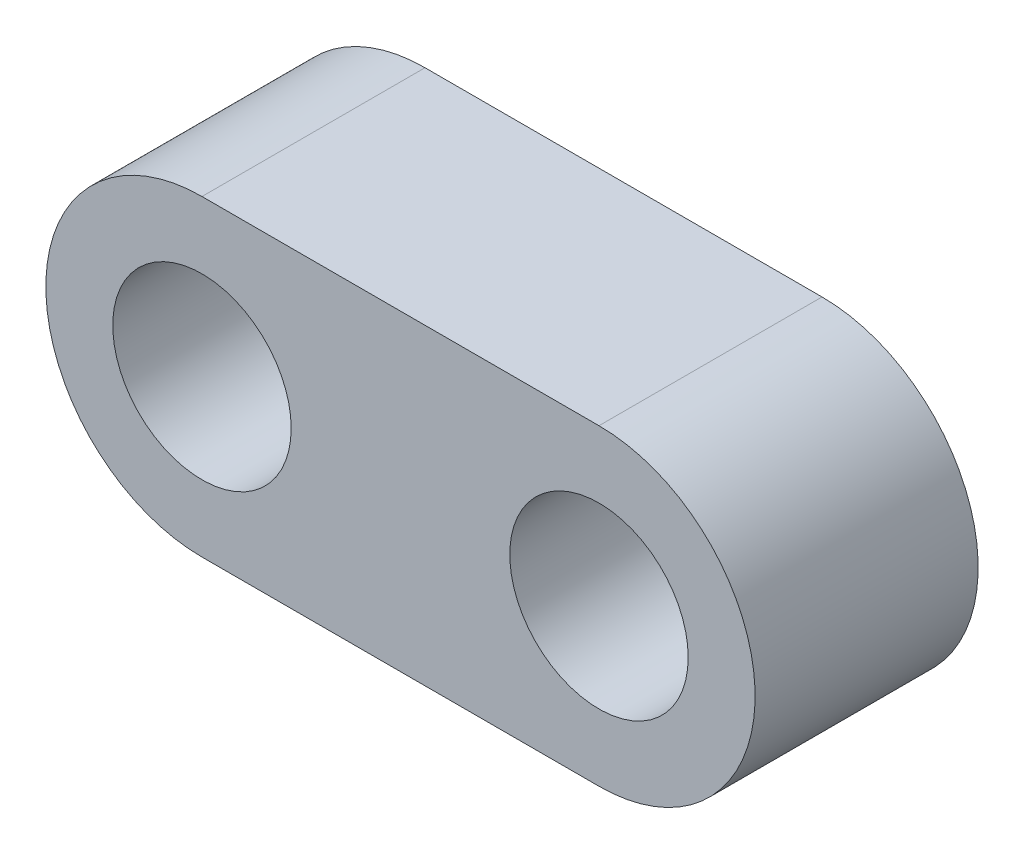
ISO-10303-21;
HEADER;
FILE_DESCRIPTION(('STEP AP214'),'2;1');
FILE_NAME('part.step','',(''),(''),'','','');
FILE_SCHEMA(('AUTOMOTIVE_DESIGN { 1 0 10303 214 1 1 1 1 }'));
ENDSEC;
DATA;
#1=APPLICATION_CONTEXT('core data for automotive mechanical design processes');
#2=APPLICATION_PROTOCOL_DEFINITION('international standard','automotive_design',2000,#1);
#3=PRODUCT_CONTEXT('',#1,'mechanical');
#4=PRODUCT('Part','Part','',(#3));
#5=PRODUCT_RELATED_PRODUCT_CATEGORY('part','',(#4));
#6=PRODUCT_DEFINITION_FORMATION('','',#4);
#7=PRODUCT_DEFINITION_CONTEXT('part definition',#1,'design');
#8=PRODUCT_DEFINITION('design','',#6,#7);
#9=PRODUCT_DEFINITION_SHAPE('','',#8);
#10=(LENGTH_UNIT() NAMED_UNIT(*) SI_UNIT(.MILLI.,.METRE.));
#11=(NAMED_UNIT(*) PLANE_ANGLE_UNIT() SI_UNIT($,.RADIAN.));
#12=(NAMED_UNIT(*) SI_UNIT($,.STERADIAN.) SOLID_ANGLE_UNIT());
#13=UNCERTAINTY_MEASURE_WITH_UNIT(LENGTH_MEASURE(1.E-05),#10,'distance_accuracy_value','');
#14=(GEOMETRIC_REPRESENTATION_CONTEXT(3) GLOBAL_UNCERTAINTY_ASSIGNED_CONTEXT((#13)) GLOBAL_UNIT_ASSIGNED_CONTEXT((#10,
#11,#12)) REPRESENTATION_CONTEXT('',''));
#15=CARTESIAN_POINT('',(0.,0.,0.));
#16=DIRECTION('',(0.,0.,1.));
#17=DIRECTION('',(1.,0.,0.));
#18=AXIS2_PLACEMENT_3D('',#15,#16,#17);
#19=CARTESIAN_POINT('',(0.,-35.,50.));
#20=DIRECTION('',(0.,-1.,0.));
#21=DIRECTION('',(1.,0.,0.));
#22=AXIS2_PLACEMENT_3D('',#19,#20,#21);
#23=PLANE('',#22);
#24=DIRECTION('',(-1.,0.,0.));
#25=VECTOR('',#24,1.);
#26=CARTESIAN_POINT('',(0.,-35.,0.));
#27=LINE('',#26,#25);
#28=CARTESIAN_POINT('',(89.,-35.,0.));
#29=VERTEX_POINT('',#28);
#30=CARTESIAN_POINT('',(0.,-35.,0.));
#31=VERTEX_POINT('',#30);
#32=EDGE_CURVE('E113',#29,#31,#27,.T.);
#33=ORIENTED_EDGE('',*,*,#32,.F.);
#34=DIRECTION('',(0.,0.,-1.));
#35=VECTOR('',#34,1.);
#36=CARTESIAN_POINT('',(89.,-35.,50.));
#37=LINE('',#36,#35);
#38=CARTESIAN_POINT('',(89.,-35.,50.));
#39=VERTEX_POINT('',#38);
#40=EDGE_CURVE('E11',#39,#29,#37,.T.);
#41=ORIENTED_EDGE('',*,*,#40,.F.);
#42=DIRECTION('',(-1.,0.,0.));
#43=VECTOR('',#42,1.);
#44=CARTESIAN_POINT('',(0.,-35.,50.));
#45=LINE('',#44,#43);
#46=CARTESIAN_POINT('',(0.,-35.,50.));
#47=VERTEX_POINT('',#46);
#48=EDGE_CURVE('E94',#39,#47,#45,.T.);
#49=ORIENTED_EDGE('',*,*,#48,.T.);
#50=DIRECTION('',(0.,0.,-1.));
#51=VECTOR('',#50,1.);
#52=CARTESIAN_POINT('',(0.,-35.,50.));
#53=LINE('',#52,#51);
#54=EDGE_CURVE('E81',#47,#31,#53,.T.);
#55=ORIENTED_EDGE('',*,*,#54,.T.);
#56=EDGE_LOOP('',(#33,#41,#49,#55));
#57=FACE_BOUND('',#56,.T.);
#58=ADVANCED_FACE('F44',(#57),#23,.T.);
#59=CARTESIAN_POINT('',(89.,0.,50.));
#60=DIRECTION('',(0.,0.,-1.));
#61=DIRECTION('',(-1.,0.,0.));
#62=AXIS2_PLACEMENT_3D('',#59,#60,#61);
#63=CYLINDRICAL_SURFACE('',#62,35.);
#64=CARTESIAN_POINT('',(89.,0.,0.));
#65=DIRECTION('',(0.,0.,1.));
#66=DIRECTION('',(1.,0.,0.));
#67=AXIS2_PLACEMENT_3D('',#64,#65,#66);
#68=CIRCLE('',#67,35.);
#69=CARTESIAN_POINT('',(89.,35.,0.));
#70=VERTEX_POINT('',#69);
#71=EDGE_CURVE('E99',#29,#70,#68,.T.);
#72=ORIENTED_EDGE('',*,*,#71,.T.);
#73=DIRECTION('',(0.,0.,-1.));
#74=VECTOR('',#73,1.);
#75=CARTESIAN_POINT('',(89.,35.,50.));
#76=LINE('',#75,#74);
#77=CARTESIAN_POINT('',(89.,35.,50.));
#78=VERTEX_POINT('',#77);
#79=EDGE_CURVE('E53',#78,#70,#76,.T.);
#80=ORIENTED_EDGE('',*,*,#79,.F.);
#81=CARTESIAN_POINT('',(89.,0.,50.));
#82=DIRECTION('',(0.,0.,1.));
#83=DIRECTION('',(1.,0.,0.));
#84=AXIS2_PLACEMENT_3D('',#81,#82,#83);
#85=CIRCLE('',#84,35.);
#86=EDGE_CURVE('E90',#39,#78,#85,.T.);
#87=ORIENTED_EDGE('',*,*,#86,.F.);
#88=ORIENTED_EDGE('',*,*,#40,.T.);
#89=EDGE_LOOP('',(#72,#80,#87,#88));
#90=FACE_BOUND('',#89,.T.);
#91=ADVANCED_FACE('F98',(#90),#63,.T.);
#92=CARTESIAN_POINT('',(0.,35.,50.));
#93=DIRECTION('',(0.,1.,0.));
#94=DIRECTION('',(-1.,0.,0.));
#95=AXIS2_PLACEMENT_3D('',#92,#93,#94);
#96=PLANE('',#95);
#97=DIRECTION('',(1.,0.,0.));
#98=VECTOR('',#97,1.);
#99=CARTESIAN_POINT('',(0.,35.,0.));
#100=LINE('',#99,#98);
#101=CARTESIAN_POINT('',(0.,35.,0.));
#102=VERTEX_POINT('',#101);
#103=EDGE_CURVE('E120',#102,#70,#100,.T.);
#104=ORIENTED_EDGE('',*,*,#103,.F.);
#105=DIRECTION('',(0.,0.,-1.));
#106=VECTOR('',#105,1.);
#107=CARTESIAN_POINT('',(0.,35.,50.));
#108=LINE('',#107,#106);
#109=CARTESIAN_POINT('',(0.,35.,50.));
#110=VERTEX_POINT('',#109);
#111=EDGE_CURVE('E79',#110,#102,#108,.T.);
#112=ORIENTED_EDGE('',*,*,#111,.F.);
#113=DIRECTION('',(1.,0.,0.));
#114=VECTOR('',#113,1.);
#115=CARTESIAN_POINT('',(0.,35.,50.));
#116=LINE('',#115,#114);
#117=EDGE_CURVE('E91',#110,#78,#116,.T.);
#118=ORIENTED_EDGE('',*,*,#117,.T.);
#119=ORIENTED_EDGE('',*,*,#79,.T.);
#120=EDGE_LOOP('',(#104,#112,#118,#119));
#121=FACE_BOUND('',#120,.T.);
#122=ADVANCED_FACE('F102',(#121),#96,.T.);
#123=CARTESIAN_POINT('',(0.,0.,50.));
#124=DIRECTION('',(0.,0.,-1.));
#125=DIRECTION('',(-1.,0.,0.));
#126=AXIS2_PLACEMENT_3D('',#123,#124,#125);
#127=CYLINDRICAL_SURFACE('',#126,20.);
#128=CARTESIAN_POINT('',(0.,0.,50.));
#129=DIRECTION('',(0.,0.,1.));
#130=DIRECTION('',(1.,0.,0.));
#131=AXIS2_PLACEMENT_3D('',#128,#129,#130);
#132=CIRCLE('',#131,20.);
#133=CARTESIAN_POINT('',(20.,0.,50.));
#134=VERTEX_POINT('',#133);
#135=EDGE_CURVE('E127',#134,#134,#132,.T.);
#136=ORIENTED_EDGE('',*,*,#135,.T.);
#137=EDGE_LOOP('',(#136));
#138=FACE_BOUND('',#137,.T.);
#139=CARTESIAN_POINT('',(0.,0.,0.));
#140=DIRECTION('',(0.,0.,1.));
#141=DIRECTION('',(1.,0.,0.));
#142=AXIS2_PLACEMENT_3D('',#139,#140,#141);
#143=CIRCLE('',#142,20.);
#144=CARTESIAN_POINT('',(20.,0.,0.));
#145=VERTEX_POINT('',#144);
#146=EDGE_CURVE('E115',#145,#145,#143,.T.);
#147=ORIENTED_EDGE('',*,*,#146,.F.);
#148=EDGE_LOOP('',(#147));
#149=FACE_BOUND('',#148,.T.);
#150=ADVANCED_FACE('F136',(#138,#149),#127,.F.);
#151=CARTESIAN_POINT('',(89.,0.,50.));
#152=DIRECTION('',(0.,0.,-1.));
#153=DIRECTION('',(-1.,0.,0.));
#154=AXIS2_PLACEMENT_3D('',#151,#152,#153);
#155=CYLINDRICAL_SURFACE('',#154,20.);
#156=CARTESIAN_POINT('',(89.,0.,50.));
#157=DIRECTION('',(0.,0.,1.));
#158=DIRECTION('',(1.,0.,0.));
#159=AXIS2_PLACEMENT_3D('',#156,#157,#158);
#160=CIRCLE('',#159,20.);
#161=CARTESIAN_POINT('',(109.,0.,50.));
#162=VERTEX_POINT('',#161);
#163=EDGE_CURVE('E125',#162,#162,#160,.T.);
#164=ORIENTED_EDGE('',*,*,#163,.T.);
#165=EDGE_LOOP('',(#164));
#166=FACE_BOUND('',#165,.T.);
#167=CARTESIAN_POINT('',(89.,0.,0.));
#168=DIRECTION('',(0.,0.,1.));
#169=DIRECTION('',(1.,0.,0.));
#170=AXIS2_PLACEMENT_3D('',#167,#168,#169);
#171=CIRCLE('',#170,20.);
#172=CARTESIAN_POINT('',(109.,0.,0.));
#173=VERTEX_POINT('',#172);
#174=EDGE_CURVE('E108',#173,#173,#171,.T.);
#175=ORIENTED_EDGE('',*,*,#174,.F.);
#176=EDGE_LOOP('',(#175));
#177=FACE_BOUND('',#176,.T.);
#178=ADVANCED_FACE('F50',(#166,#177),#155,.F.);
#179=CARTESIAN_POINT('',(0.,0.,50.));
#180=DIRECTION('',(0.,0.,-1.));
#181=DIRECTION('',(-1.,0.,0.));
#182=AXIS2_PLACEMENT_3D('',#179,#180,#181);
#183=CYLINDRICAL_SURFACE('',#182,35.);
#184=CARTESIAN_POINT('',(0.,0.,0.));
#185=DIRECTION('',(0.,0.,1.));
#186=DIRECTION('',(1.,0.,0.));
#187=AXIS2_PLACEMENT_3D('',#184,#185,#186);
#188=CIRCLE('',#187,35.);
#189=EDGE_CURVE('E122',#102,#31,#188,.T.);
#190=ORIENTED_EDGE('',*,*,#189,.T.);
#191=ORIENTED_EDGE('',*,*,#54,.F.);
#192=CARTESIAN_POINT('',(0.,0.,50.));
#193=DIRECTION('',(0.,0.,1.));
#194=DIRECTION('',(1.,0.,0.));
#195=AXIS2_PLACEMENT_3D('',#192,#193,#194);
#196=CIRCLE('',#195,35.);
#197=EDGE_CURVE('E64',#110,#47,#196,.T.);
#198=ORIENTED_EDGE('',*,*,#197,.F.);
#199=ORIENTED_EDGE('',*,*,#111,.T.);
#200=EDGE_LOOP('',(#190,#191,#198,#199));
#201=FACE_BOUND('',#200,.T.);
#202=ADVANCED_FACE('F148',(#201),#183,.T.);
#203=CARTESIAN_POINT('',(0.,0.,50.));
#204=DIRECTION('',(0.,0.,1.));
#205=DIRECTION('',(1.,0.,0.));
#206=AXIS2_PLACEMENT_3D('',#203,#204,#205);
#207=PLANE('',#206);
#208=ORIENTED_EDGE('',*,*,#163,.F.);
#209=EDGE_LOOP('',(#208));
#210=FACE_BOUND('',#209,.T.);
#211=ORIENTED_EDGE('',*,*,#135,.F.);
#212=EDGE_LOOP('',(#211));
#213=FACE_BOUND('',#212,.T.);
#214=ORIENTED_EDGE('',*,*,#48,.F.);
#215=ORIENTED_EDGE('',*,*,#86,.T.);
#216=ORIENTED_EDGE('',*,*,#117,.F.);
#217=ORIENTED_EDGE('',*,*,#197,.T.);
#218=EDGE_LOOP('',(#214,#215,#216,#217));
#219=FACE_BOUND('',#218,.T.);
#220=ADVANCED_FACE('F93',(#210,#213,#219),#207,.T.);
#221=CARTESIAN_POINT('',(0.,0.,0.));
#222=DIRECTION('',(0.,0.,1.));
#223=DIRECTION('',(1.,0.,0.));
#224=AXIS2_PLACEMENT_3D('',#221,#222,#223);
#225=PLANE('',#224);
#226=ORIENTED_EDGE('',*,*,#174,.T.);
#227=EDGE_LOOP('',(#226));
#228=FACE_BOUND('',#227,.T.);
#229=ORIENTED_EDGE('',*,*,#146,.T.);
#230=EDGE_LOOP('',(#229));
#231=FACE_BOUND('',#230,.T.);
#232=ORIENTED_EDGE('',*,*,#32,.T.);
#233=ORIENTED_EDGE('',*,*,#189,.F.);
#234=ORIENTED_EDGE('',*,*,#103,.T.);
#235=ORIENTED_EDGE('',*,*,#71,.F.);
#236=EDGE_LOOP('',(#232,#233,#234,#235));
#237=FACE_BOUND('',#236,.T.);
#238=ADVANCED_FACE('F151',(#228,#231,#237),#225,.F.);
#239=CLOSED_SHELL('',(#58,#91,#122,#150,#178,#202,#220,#238));
#240=MANIFOLD_SOLID_BREP('B2',#239);
#241=ADVANCED_BREP_SHAPE_REPRESENTATION('',(#18,#240),#14);
#242=SHAPE_DEFINITION_REPRESENTATION(#9,#241);
ENDSEC;
END-ISO-10303-21;
